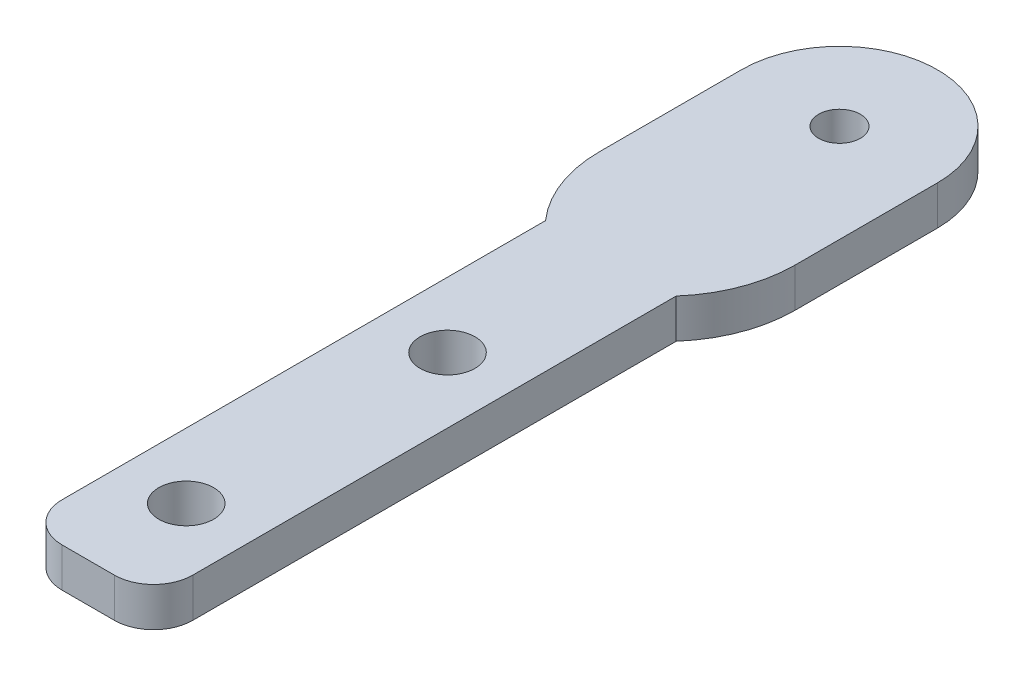
ISO-10303-21;
HEADER;
FILE_DESCRIPTION(('STEP AP214'),'2;1');
FILE_NAME('part.step','',(''),(''),'','','');
FILE_SCHEMA(('AUTOMOTIVE_DESIGN { 1 0 10303 214 1 1 1 1 }'));
ENDSEC;
DATA;
#1=APPLICATION_CONTEXT('core data for automotive mechanical design processes');
#2=APPLICATION_PROTOCOL_DEFINITION('international standard','automotive_design',2000,#1);
#3=PRODUCT_CONTEXT('',#1,'mechanical');
#4=PRODUCT('Part','Part','',(#3));
#5=PRODUCT_RELATED_PRODUCT_CATEGORY('part','',(#4));
#6=PRODUCT_DEFINITION_FORMATION('','',#4);
#7=PRODUCT_DEFINITION_CONTEXT('part definition',#1,'design');
#8=PRODUCT_DEFINITION('design','',#6,#7);
#9=PRODUCT_DEFINITION_SHAPE('','',#8);
#10=(LENGTH_UNIT() NAMED_UNIT(*) SI_UNIT(.MILLI.,.METRE.));
#11=(NAMED_UNIT(*) PLANE_ANGLE_UNIT() SI_UNIT($,.RADIAN.));
#12=(NAMED_UNIT(*) SI_UNIT($,.STERADIAN.) SOLID_ANGLE_UNIT());
#13=UNCERTAINTY_MEASURE_WITH_UNIT(LENGTH_MEASURE(1.E-05),#10,'distance_accuracy_value','');
#14=(GEOMETRIC_REPRESENTATION_CONTEXT(3) GLOBAL_UNCERTAINTY_ASSIGNED_CONTEXT((#13)) GLOBAL_UNIT_ASSIGNED_CONTEXT((#10,
#11,#12)) REPRESENTATION_CONTEXT('',''));
#15=CARTESIAN_POINT('',(0.,0.,0.));
#16=DIRECTION('',(0.,0.,1.));
#17=DIRECTION('',(1.,0.,0.));
#18=AXIS2_PLACEMENT_3D('',#15,#16,#17);
#19=CARTESIAN_POINT('',(0.,3.,-30.0000000000001));
#20=DIRECTION('',(0.,-1.,0.));
#21=DIRECTION('',(0.,0.,-1.));
#22=AXIS2_PLACEMENT_3D('',#19,#20,#21);
#23=CYLINDRICAL_SURFACE('',#22,7.5);
#24=CARTESIAN_POINT('',(0.,0.,-30.0000000000001));
#25=DIRECTION('',(0.,1.,0.));
#26=DIRECTION('',(0.,0.,-1.));
#27=AXIS2_PLACEMENT_3D('',#24,#25,#26);
#28=CIRCLE('',#27,7.5);
#29=CARTESIAN_POINT('',(7.50000000000006,0.,-30.0000000000001));
#30=VERTEX_POINT('',#29);
#31=CARTESIAN_POINT('',(-7.49999999999994,0.,-30.0000000000001));
#32=VERTEX_POINT('',#31);
#33=EDGE_CURVE('E166',#30,#32,#28,.T.);
#34=ORIENTED_EDGE('',*,*,#33,.T.);
#35=DIRECTION('',(0.,-1.,0.));
#36=VECTOR('',#35,1.);
#37=CARTESIAN_POINT('',(-7.49999999999994,3.,-30.0000000000001));
#38=LINE('',#37,#36);
#39=CARTESIAN_POINT('',(-7.49999999999994,3.,-30.0000000000001));
#40=VERTEX_POINT('',#39);
#41=EDGE_CURVE('E186',#40,#32,#38,.T.);
#42=ORIENTED_EDGE('',*,*,#41,.F.);
#43=CARTESIAN_POINT('',(0.,3.,-30.0000000000001));
#44=DIRECTION('',(0.,1.,0.));
#45=DIRECTION('',(0.,0.,-1.));
#46=AXIS2_PLACEMENT_3D('',#43,#44,#45);
#47=CIRCLE('',#46,7.5);
#48=CARTESIAN_POINT('',(7.50000000000006,3.,-30.0000000000001));
#49=VERTEX_POINT('',#48);
#50=EDGE_CURVE('E169',#49,#40,#47,.T.);
#51=ORIENTED_EDGE('',*,*,#50,.F.);
#52=DIRECTION('',(0.,-1.,0.));
#53=VECTOR('',#52,1.);
#54=CARTESIAN_POINT('',(7.50000000000006,3.,-30.0000000000001));
#55=LINE('',#54,#53);
#56=EDGE_CURVE('E178',#49,#30,#55,.T.);
#57=ORIENTED_EDGE('',*,*,#56,.T.);
#58=EDGE_LOOP('',(#34,#42,#51,#57));
#59=FACE_BOUND('',#58,.T.);
#60=ADVANCED_FACE('F36',(#59),#23,.T.);
#61=CARTESIAN_POINT('',(-7.49999999999994,3.,29.9999999999999));
#62=DIRECTION('',(1.,0.,0.));
#63=DIRECTION('',(0.,0.,-1.));
#64=AXIS2_PLACEMENT_3D('',#61,#62,#63);
#65=PLANE('',#64);
#66=DIRECTION('',(0.,0.,1.));
#67=VECTOR('',#66,1.);
#68=CARTESIAN_POINT('',(-7.49999999999994,0.,29.9999999999999));
#69=LINE('',#68,#67);
#70=CARTESIAN_POINT('',(-7.49999999999994,0.,-19.1165407775884));
#71=VERTEX_POINT('',#70);
#72=EDGE_CURVE('E181',#32,#71,#69,.T.);
#73=ORIENTED_EDGE('',*,*,#72,.T.);
#74=DIRECTION('',(0.,-1.,0.));
#75=VECTOR('',#74,1.);
#76=CARTESIAN_POINT('',(-7.49999999999994,3.,-19.1165407775884));
#77=LINE('',#76,#75);
#78=CARTESIAN_POINT('',(-7.49999999999994,3.,-19.1165407775884));
#79=VERTEX_POINT('',#78);
#80=EDGE_CURVE('E120',#71,#79,#77,.F.);
#81=ORIENTED_EDGE('',*,*,#80,.T.);
#82=DIRECTION('',(0.,0.,1.));
#83=VECTOR('',#82,1.);
#84=CARTESIAN_POINT('',(-7.49999999999994,3.,29.9999999999999));
#85=LINE('',#84,#83);
#86=EDGE_CURVE('E172',#40,#79,#85,.T.);
#87=ORIENTED_EDGE('',*,*,#86,.F.);
#88=ORIENTED_EDGE('',*,*,#41,.T.);
#89=EDGE_LOOP('',(#73,#81,#87,#88));
#90=FACE_BOUND('',#89,.T.);
#91=ADVANCED_FACE('F227',(#90),#65,.F.);
#92=CARTESIAN_POINT('',(7.50000000000006,3.,29.9999999999999));
#93=DIRECTION('',(-1.,0.,0.));
#94=DIRECTION('',(0.,0.,1.));
#95=AXIS2_PLACEMENT_3D('',#92,#93,#94);
#96=PLANE('',#95);
#97=DIRECTION('',(0.,0.,-1.));
#98=VECTOR('',#97,1.);
#99=CARTESIAN_POINT('',(7.50000000000006,3.,29.9999999999999));
#100=LINE('',#99,#98);
#101=CARTESIAN_POINT('',(7.50000000000006,3.,-19.1122145201041));
#102=VERTEX_POINT('',#101);
#103=EDGE_CURVE('E176',#102,#49,#100,.T.);
#104=ORIENTED_EDGE('',*,*,#103,.F.);
#105=DIRECTION('',(0.,1.,0.));
#106=VECTOR('',#105,1.);
#107=CARTESIAN_POINT('',(7.50000000000006,3.,-19.112214520104));
#108=LINE('',#107,#106);
#109=CARTESIAN_POINT('',(7.50000000000006,0.,-19.1122145201041));
#110=VERTEX_POINT('',#109);
#111=EDGE_CURVE('E125',#102,#110,#108,.F.);
#112=ORIENTED_EDGE('',*,*,#111,.T.);
#113=DIRECTION('',(0.,0.,-1.));
#114=VECTOR('',#113,1.);
#115=CARTESIAN_POINT('',(7.50000000000006,0.,29.9999999999999));
#116=LINE('',#115,#114);
#117=EDGE_CURVE('E173',#110,#30,#116,.T.);
#118=ORIENTED_EDGE('',*,*,#117,.T.);
#119=ORIENTED_EDGE('',*,*,#56,.F.);
#120=EDGE_LOOP('',(#104,#112,#118,#119));
#121=FACE_BOUND('',#120,.T.);
#122=ADVANCED_FACE('F234',(#121),#96,.F.);
#123=CARTESIAN_POINT('',(0.,3.,-30.0000000000001));
#124=DIRECTION('',(0.,-1.,0.));
#125=DIRECTION('',(0.,0.,-1.));
#126=AXIS2_PLACEMENT_3D('',#123,#124,#125);
#127=PLANE('',#126);
#128=CARTESIAN_POINT('',(0.,3.,19.9999999999999));
#129=DIRECTION('',(0.,-1.,0.));
#130=DIRECTION('',(0.,0.,-1.));
#131=AXIS2_PLACEMENT_3D('',#128,#129,#130);
#132=CIRCLE('',#131,2.1);
#133=CARTESIAN_POINT('',(0.,3.,17.8999999999999));
#134=VERTEX_POINT('',#133);
#135=EDGE_CURVE('E151',#134,#134,#132,.T.);
#136=ORIENTED_EDGE('',*,*,#135,.T.);
#137=EDGE_LOOP('',(#136));
#138=FACE_BOUND('',#137,.T.);
#139=CARTESIAN_POINT('',(0.,3.,-1.42247325030098E-13));
#140=DIRECTION('',(0.,-1.,0.));
#141=DIRECTION('',(0.,0.,-1.));
#142=AXIS2_PLACEMENT_3D('',#139,#140,#141);
#143=CIRCLE('',#142,2.1);
#144=CARTESIAN_POINT('',(0.,3.,-2.10000000000014));
#145=VERTEX_POINT('',#144);
#146=EDGE_CURVE('E158',#145,#145,#143,.T.);
#147=ORIENTED_EDGE('',*,*,#146,.T.);
#148=EDGE_LOOP('',(#147));
#149=FACE_BOUND('',#148,.T.);
#150=CARTESIAN_POINT('',(0.,3.,-30.0000000000001));
#151=DIRECTION('',(0.,1.,0.));
#152=DIRECTION('',(0.,0.,1.));
#153=AXIS2_PLACEMENT_3D('',#150,#151,#152);
#154=CIRCLE('',#153,1.6);
#155=CARTESIAN_POINT('',(0.,3.,-28.4000000000001));
#156=VERTEX_POINT('',#155);
#157=EDGE_CURVE('E154',#156,#156,#154,.T.);
#158=ORIENTED_EDGE('',*,*,#157,.F.);
#159=EDGE_LOOP('',(#158));
#160=FACE_BOUND('',#159,.T.);
#161=DIRECTION('',(1.,0.,0.));
#162=VECTOR('',#161,1.);
#163=CARTESIAN_POINT('',(0.,3.,27.4999999999999));
#164=LINE('',#163,#162);
#165=CARTESIAN_POINT('',(-1.99809229994611,3.,27.4999999999999));
#166=VERTEX_POINT('',#165);
#167=CARTESIAN_POINT('',(2.00190770005388,3.,27.4999999999999));
#168=VERTEX_POINT('',#167);
#169=EDGE_CURVE('E146',#166,#168,#164,.T.);
#170=ORIENTED_EDGE('',*,*,#169,.T.);
#171=CARTESIAN_POINT('',(2.00190770005388,3.,24.4999999999999));
#172=DIRECTION('',(0.,-1.,0.));
#173=DIRECTION('',(0.,0.,-1.));
#174=AXIS2_PLACEMENT_3D('',#171,#172,#173);
#175=CIRCLE('',#174,3.);
#176=CARTESIAN_POINT('',(5.00190770005389,3.,24.4999999999999));
#177=VERTEX_POINT('',#176);
#178=EDGE_CURVE('E44',#168,#177,#175,.F.);
#179=ORIENTED_EDGE('',*,*,#178,.T.);
#180=DIRECTION('',(0.,0.,-1.));
#181=VECTOR('',#180,1.);
#182=CARTESIAN_POINT('',(5.00190770005389,3.,-30.0000000000001));
#183=LINE('',#182,#181);
#184=CARTESIAN_POINT('',(5.00190770005389,3.,-12.5000000000001));
#185=VERTEX_POINT('',#184);
#186=EDGE_CURVE('E148',#177,#185,#183,.T.);
#187=ORIENTED_EDGE('',*,*,#186,.T.);
#188=CARTESIAN_POINT('',(-2.49999999999994,3.,-19.1122145201041));
#189=DIRECTION('',(0.,-1.,0.));
#190=DIRECTION('',(0.,0.,-1.));
#191=AXIS2_PLACEMENT_3D('',#188,#189,#190);
#192=CIRCLE('',#191,10.);
#193=EDGE_CURVE('E195',#185,#102,#192,.F.);
#194=ORIENTED_EDGE('',*,*,#193,.T.);
#195=ORIENTED_EDGE('',*,*,#103,.T.);
#196=ORIENTED_EDGE('',*,*,#50,.T.);
#197=ORIENTED_EDGE('',*,*,#86,.T.);
#198=CARTESIAN_POINT('',(2.50000000000006,3.,-19.1165407775884));
#199=DIRECTION('',(0.,-1.,0.));
#200=DIRECTION('',(0.,0.,-1.));
#201=AXIS2_PLACEMENT_3D('',#198,#199,#200);
#202=CIRCLE('',#201,10.);
#203=CARTESIAN_POINT('',(-4.99809229994611,3.,-12.5000000000001));
#204=VERTEX_POINT('',#203);
#205=EDGE_CURVE('E193',#79,#204,#202,.F.);
#206=ORIENTED_EDGE('',*,*,#205,.T.);
#207=DIRECTION('',(0.,0.,1.));
#208=VECTOR('',#207,1.);
#209=CARTESIAN_POINT('',(-4.99809229994611,3.,-30.0000000000001));
#210=LINE('',#209,#208);
#211=CARTESIAN_POINT('',(-4.99809229994611,3.,24.4999999999999));
#212=VERTEX_POINT('',#211);
#213=EDGE_CURVE('E129',#204,#212,#210,.T.);
#214=ORIENTED_EDGE('',*,*,#213,.T.);
#215=CARTESIAN_POINT('',(-1.99809229994611,3.,24.4999999999999));
#216=DIRECTION('',(0.,-1.,0.));
#217=DIRECTION('',(0.,0.,-1.));
#218=AXIS2_PLACEMENT_3D('',#215,#216,#217);
#219=CIRCLE('',#218,3.);
#220=EDGE_CURVE('E208',#212,#166,#219,.F.);
#221=ORIENTED_EDGE('',*,*,#220,.T.);
#222=EDGE_LOOP('',(#170,#179,#187,#194,#195,#196,#197,#206,#214,#221));
#223=FACE_BOUND('',#222,.T.);
#224=ADVANCED_FACE('F212',(#138,#149,#160,#223),#127,.F.);
#225=CARTESIAN_POINT('',(0.,0.,-30.0000000000001));
#226=DIRECTION('',(0.,-1.,0.));
#227=DIRECTION('',(0.,0.,-1.));
#228=AXIS2_PLACEMENT_3D('',#225,#226,#227);
#229=PLANE('',#228);
#230=DIRECTION('',(0.,0.,-1.));
#231=VECTOR('',#230,1.);
#232=CARTESIAN_POINT('',(5.00190770005388,0.,27.4999999999999));
#233=LINE('',#232,#231);
#234=CARTESIAN_POINT('',(5.00190770005388,0.,24.4999999999999));
#235=VERTEX_POINT('',#234);
#236=CARTESIAN_POINT('',(5.00190770005389,0.,-12.5000000000001));
#237=VERTEX_POINT('',#236);
#238=EDGE_CURVE('E131',#235,#237,#233,.T.);
#239=ORIENTED_EDGE('',*,*,#238,.F.);
#240=CARTESIAN_POINT('',(2.00190770005388,0.,24.4999999999999));
#241=DIRECTION('',(0.,-1.,0.));
#242=DIRECTION('',(0.,0.,-1.));
#243=AXIS2_PLACEMENT_3D('',#240,#241,#242);
#244=CIRCLE('',#243,3.);
#245=CARTESIAN_POINT('',(2.00190770005389,0.,27.4999999999999));
#246=VERTEX_POINT('',#245);
#247=EDGE_CURVE('E202',#235,#246,#244,.T.);
#248=ORIENTED_EDGE('',*,*,#247,.T.);
#249=DIRECTION('',(1.,0.,0.));
#250=VECTOR('',#249,1.);
#251=CARTESIAN_POINT('',(-4.99809229994611,0.,27.4999999999999));
#252=LINE('',#251,#250);
#253=CARTESIAN_POINT('',(-1.99809229994611,0.,27.4999999999999));
#254=VERTEX_POINT('',#253);
#255=EDGE_CURVE('E138',#254,#246,#252,.T.);
#256=ORIENTED_EDGE('',*,*,#255,.F.);
#257=CARTESIAN_POINT('',(-1.99809229994611,0.,24.4999999999999));
#258=DIRECTION('',(0.,-1.,0.));
#259=DIRECTION('',(0.,0.,-1.));
#260=AXIS2_PLACEMENT_3D('',#257,#258,#259);
#261=CIRCLE('',#260,3.);
#262=CARTESIAN_POINT('',(-4.99809229994611,0.,24.4999999999999));
#263=VERTEX_POINT('',#262);
#264=EDGE_CURVE('E137',#254,#263,#261,.T.);
#265=ORIENTED_EDGE('',*,*,#264,.T.);
#266=DIRECTION('',(0.,0.,1.));
#267=VECTOR('',#266,1.);
#268=CARTESIAN_POINT('',(-4.99809229994611,0.,-12.5000000000001));
#269=LINE('',#268,#267);
#270=CARTESIAN_POINT('',(-4.99809229994611,0.,-12.5000000000001));
#271=VERTEX_POINT('',#270);
#272=EDGE_CURVE('E128',#271,#263,#269,.T.);
#273=ORIENTED_EDGE('',*,*,#272,.F.);
#274=CARTESIAN_POINT('',(2.50000000000006,0.,-19.1165407775884));
#275=DIRECTION('',(0.,-1.,0.));
#276=DIRECTION('',(0.,0.,-1.));
#277=AXIS2_PLACEMENT_3D('',#274,#275,#276);
#278=CIRCLE('',#277,10.);
#279=EDGE_CURVE('E115',#271,#71,#278,.T.);
#280=ORIENTED_EDGE('',*,*,#279,.T.);
#281=ORIENTED_EDGE('',*,*,#72,.F.);
#282=ORIENTED_EDGE('',*,*,#33,.F.);
#283=ORIENTED_EDGE('',*,*,#117,.F.);
#284=CARTESIAN_POINT('',(-2.49999999999994,0.,-19.1122145201041));
#285=DIRECTION('',(0.,-1.,0.));
#286=DIRECTION('',(0.,0.,-1.));
#287=AXIS2_PLACEMENT_3D('',#284,#285,#286);
#288=CIRCLE('',#287,10.);
#289=EDGE_CURVE('E124',#110,#237,#288,.T.);
#290=ORIENTED_EDGE('',*,*,#289,.T.);
#291=EDGE_LOOP('',(#239,#248,#256,#265,#273,#280,#281,#282,#283,#290));
#292=FACE_BOUND('',#291,.T.);
#293=CARTESIAN_POINT('',(0.,0.,19.9999999999999));
#294=DIRECTION('',(0.,-1.,0.));
#295=DIRECTION('',(0.,0.,-1.));
#296=AXIS2_PLACEMENT_3D('',#293,#294,#295);
#297=CIRCLE('',#296,2.1);
#298=CARTESIAN_POINT('',(0.,0.,17.8999999999999));
#299=VERTEX_POINT('',#298);
#300=EDGE_CURVE('E155',#299,#299,#297,.T.);
#301=ORIENTED_EDGE('',*,*,#300,.F.);
#302=EDGE_LOOP('',(#301));
#303=FACE_BOUND('',#302,.T.);
#304=CARTESIAN_POINT('',(0.,0.,-1.42247325030098E-13));
#305=DIRECTION('',(0.,-1.,0.));
#306=DIRECTION('',(0.,0.,-1.));
#307=AXIS2_PLACEMENT_3D('',#304,#305,#306);
#308=CIRCLE('',#307,2.1);
#309=CARTESIAN_POINT('',(0.,0.,-2.10000000000014));
#310=VERTEX_POINT('',#309);
#311=EDGE_CURVE('E150',#310,#310,#308,.T.);
#312=ORIENTED_EDGE('',*,*,#311,.F.);
#313=EDGE_LOOP('',(#312));
#314=FACE_BOUND('',#313,.T.);
#315=CARTESIAN_POINT('',(0.,0.,-30.0000000000001));
#316=DIRECTION('',(0.,1.,0.));
#317=DIRECTION('',(0.,0.,1.));
#318=AXIS2_PLACEMENT_3D('',#315,#316,#317);
#319=CIRCLE('',#318,1.6);
#320=CARTESIAN_POINT('',(0.,0.,-28.4000000000001));
#321=VERTEX_POINT('',#320);
#322=EDGE_CURVE('E163',#321,#321,#319,.T.);
#323=ORIENTED_EDGE('',*,*,#322,.T.);
#324=EDGE_LOOP('',(#323));
#325=FACE_BOUND('',#324,.T.);
#326=ADVANCED_FACE('F134',(#292,#303,#314,#325),#229,.T.);
#327=CARTESIAN_POINT('',(0.,0.,-30.0000000000001));
#328=DIRECTION('',(0.,1.,0.));
#329=DIRECTION('',(0.,0.,1.));
#330=AXIS2_PLACEMENT_3D('',#327,#328,#329);
#331=CYLINDRICAL_SURFACE('',#330,1.6);
#332=ORIENTED_EDGE('',*,*,#322,.F.);
#333=EDGE_LOOP('',(#332));
#334=FACE_BOUND('',#333,.T.);
#335=ORIENTED_EDGE('',*,*,#157,.T.);
#336=EDGE_LOOP('',(#335));
#337=FACE_BOUND('',#336,.T.);
#338=ADVANCED_FACE('F257',(#334,#337),#331,.F.);
#339=CARTESIAN_POINT('',(0.,3.,-1.42247325030098E-13));
#340=DIRECTION('',(0.,-1.,0.));
#341=DIRECTION('',(0.,0.,-1.));
#342=AXIS2_PLACEMENT_3D('',#339,#340,#341);
#343=CYLINDRICAL_SURFACE('',#342,2.1);
#344=ORIENTED_EDGE('',*,*,#146,.F.);
#345=EDGE_LOOP('',(#344));
#346=FACE_BOUND('',#345,.T.);
#347=ORIENTED_EDGE('',*,*,#311,.T.);
#348=EDGE_LOOP('',(#347));
#349=FACE_BOUND('',#348,.T.);
#350=ADVANCED_FACE('F263',(#346,#349),#343,.F.);
#351=CARTESIAN_POINT('',(0.,3.,19.9999999999999));
#352=DIRECTION('',(0.,-1.,0.));
#353=DIRECTION('',(0.,0.,-1.));
#354=AXIS2_PLACEMENT_3D('',#351,#352,#353);
#355=CYLINDRICAL_SURFACE('',#354,2.1);
#356=ORIENTED_EDGE('',*,*,#135,.F.);
#357=EDGE_LOOP('',(#356));
#358=FACE_BOUND('',#357,.T.);
#359=ORIENTED_EDGE('',*,*,#300,.T.);
#360=EDGE_LOOP('',(#359));
#361=FACE_BOUND('',#360,.T.);
#362=ADVANCED_FACE('F267',(#358,#361),#355,.F.);
#363=CARTESIAN_POINT('',(5.00190770005388,10.,27.4999999999999));
#364=DIRECTION('',(-1.,0.,0.));
#365=DIRECTION('',(0.,0.,1.));
#366=AXIS2_PLACEMENT_3D('',#363,#364,#365);
#367=PLANE('',#366);
#368=ORIENTED_EDGE('',*,*,#186,.F.);
#369=DIRECTION('',(0.,-1.,0.));
#370=VECTOR('',#369,1.);
#371=CARTESIAN_POINT('',(5.00190770005388,10.,24.4999999999999));
#372=LINE('',#371,#370);
#373=EDGE_CURVE('E198',#177,#235,#372,.T.);
#374=ORIENTED_EDGE('',*,*,#373,.T.);
#375=ORIENTED_EDGE('',*,*,#238,.T.);
#376=DIRECTION('',(0.,-1.,0.));
#377=VECTOR('',#376,1.);
#378=CARTESIAN_POINT('',(5.00190770005389,10.,-12.5000000000001));
#379=LINE('',#378,#377);
#380=EDGE_CURVE('E130',#185,#237,#379,.T.);
#381=ORIENTED_EDGE('',*,*,#380,.F.);
#382=EDGE_LOOP('',(#368,#374,#375,#381));
#383=FACE_BOUND('',#382,.T.);
#384=ADVANCED_FACE('F217',(#383),#367,.F.);
#385=CARTESIAN_POINT('',(-4.99809229994611,10.,27.4999999999999));
#386=DIRECTION('',(0.,0.,-1.));
#387=DIRECTION('',(-1.,0.,0.));
#388=AXIS2_PLACEMENT_3D('',#385,#386,#387);
#389=PLANE('',#388);
#390=ORIENTED_EDGE('',*,*,#255,.T.);
#391=DIRECTION('',(0.,-1.,0.));
#392=VECTOR('',#391,1.);
#393=CARTESIAN_POINT('',(2.00190770005389,10.,27.4999999999999));
#394=LINE('',#393,#392);
#395=EDGE_CURVE('E57',#246,#168,#394,.F.);
#396=ORIENTED_EDGE('',*,*,#395,.T.);
#397=ORIENTED_EDGE('',*,*,#169,.F.);
#398=DIRECTION('',(0.,-1.,0.));
#399=VECTOR('',#398,1.);
#400=CARTESIAN_POINT('',(-1.99809229994611,10.,27.4999999999999));
#401=LINE('',#400,#399);
#402=EDGE_CURVE('E204',#166,#254,#401,.T.);
#403=ORIENTED_EDGE('',*,*,#402,.T.);
#404=EDGE_LOOP('',(#390,#396,#397,#403));
#405=FACE_BOUND('',#404,.T.);
#406=ADVANCED_FACE('F220',(#405),#389,.F.);
#407=CARTESIAN_POINT('',(-4.99809229994611,10.,-12.5000000000001));
#408=DIRECTION('',(1.,0.,0.));
#409=DIRECTION('',(0.,0.,-1.));
#410=AXIS2_PLACEMENT_3D('',#407,#408,#409);
#411=PLANE('',#410);
#412=ORIENTED_EDGE('',*,*,#272,.T.);
#413=DIRECTION('',(0.,-1.,0.));
#414=VECTOR('',#413,1.);
#415=CARTESIAN_POINT('',(-4.99809229994611,10.,24.4999999999999));
#416=LINE('',#415,#414);
#417=EDGE_CURVE('E11',#263,#212,#416,.F.);
#418=ORIENTED_EDGE('',*,*,#417,.T.);
#419=ORIENTED_EDGE('',*,*,#213,.F.);
#420=DIRECTION('',(0.,-1.,0.));
#421=VECTOR('',#420,1.);
#422=CARTESIAN_POINT('',(-4.99809229994611,10.,-12.5000000000001));
#423=LINE('',#422,#421);
#424=EDGE_CURVE('E119',#204,#271,#423,.T.);
#425=ORIENTED_EDGE('',*,*,#424,.T.);
#426=EDGE_LOOP('',(#412,#418,#419,#425));
#427=FACE_BOUND('',#426,.T.);
#428=ADVANCED_FACE('F127',(#427),#411,.F.);
#429=CARTESIAN_POINT('',(-2.49999999999994,10.,-19.1122145201041));
#430=DIRECTION('',(0.,1.,0.));
#431=DIRECTION('',(0.,0.,1.));
#432=AXIS2_PLACEMENT_3D('',#429,#430,#431);
#433=CYLINDRICAL_SURFACE('',#432,10.);
#434=ORIENTED_EDGE('',*,*,#193,.F.);
#435=ORIENTED_EDGE('',*,*,#380,.T.);
#436=ORIENTED_EDGE('',*,*,#289,.F.);
#437=ORIENTED_EDGE('',*,*,#111,.F.);
#438=EDGE_LOOP('',(#434,#435,#436,#437));
#439=FACE_BOUND('',#438,.T.);
#440=ADVANCED_FACE('F237',(#439),#433,.T.);
#441=CARTESIAN_POINT('',(2.50000000000006,10.,-19.1165407775884));
#442=DIRECTION('',(0.,-1.,0.));
#443=DIRECTION('',(0.,0.,-1.));
#444=AXIS2_PLACEMENT_3D('',#441,#442,#443);
#445=CYLINDRICAL_SURFACE('',#444,10.);
#446=ORIENTED_EDGE('',*,*,#205,.F.);
#447=ORIENTED_EDGE('',*,*,#80,.F.);
#448=ORIENTED_EDGE('',*,*,#279,.F.);
#449=ORIENTED_EDGE('',*,*,#424,.F.);
#450=EDGE_LOOP('',(#446,#447,#448,#449));
#451=FACE_BOUND('',#450,.T.);
#452=ADVANCED_FACE('F118',(#451),#445,.T.);
#453=CARTESIAN_POINT('',(2.00190770005388,10.,24.4999999999999));
#454=DIRECTION('',(0.,-1.,0.));
#455=DIRECTION('',(0.,0.,-1.));
#456=AXIS2_PLACEMENT_3D('',#453,#454,#455);
#457=CYLINDRICAL_SURFACE('',#456,3.);
#458=ORIENTED_EDGE('',*,*,#178,.F.);
#459=ORIENTED_EDGE('',*,*,#395,.F.);
#460=ORIENTED_EDGE('',*,*,#247,.F.);
#461=ORIENTED_EDGE('',*,*,#373,.F.);
#462=EDGE_LOOP('',(#458,#459,#460,#461));
#463=FACE_BOUND('',#462,.T.);
#464=ADVANCED_FACE('F219',(#463),#457,.T.);
#465=CARTESIAN_POINT('',(-1.99809229994611,10.,24.4999999999999));
#466=DIRECTION('',(0.,-1.,0.));
#467=DIRECTION('',(0.,0.,-1.));
#468=AXIS2_PLACEMENT_3D('',#465,#466,#467);
#469=CYLINDRICAL_SURFACE('',#468,3.);
#470=ORIENTED_EDGE('',*,*,#220,.F.);
#471=ORIENTED_EDGE('',*,*,#417,.F.);
#472=ORIENTED_EDGE('',*,*,#264,.F.);
#473=ORIENTED_EDGE('',*,*,#402,.F.);
#474=EDGE_LOOP('',(#470,#471,#472,#473));
#475=FACE_BOUND('',#474,.T.);
#476=ADVANCED_FACE('F38',(#475),#469,.T.);
#477=CLOSED_SHELL('',(#60,#91,#122,#224,#326,#338,#350,#362,#384,#406,#428,#440,#452,#464,#476));
#478=MANIFOLD_SOLID_BREP('B2',#477);
#479=ADVANCED_BREP_SHAPE_REPRESENTATION('',(#18,#478),#14);
#480=SHAPE_DEFINITION_REPRESENTATION(#9,#479);
ENDSEC;
END-ISO-10303-21;
